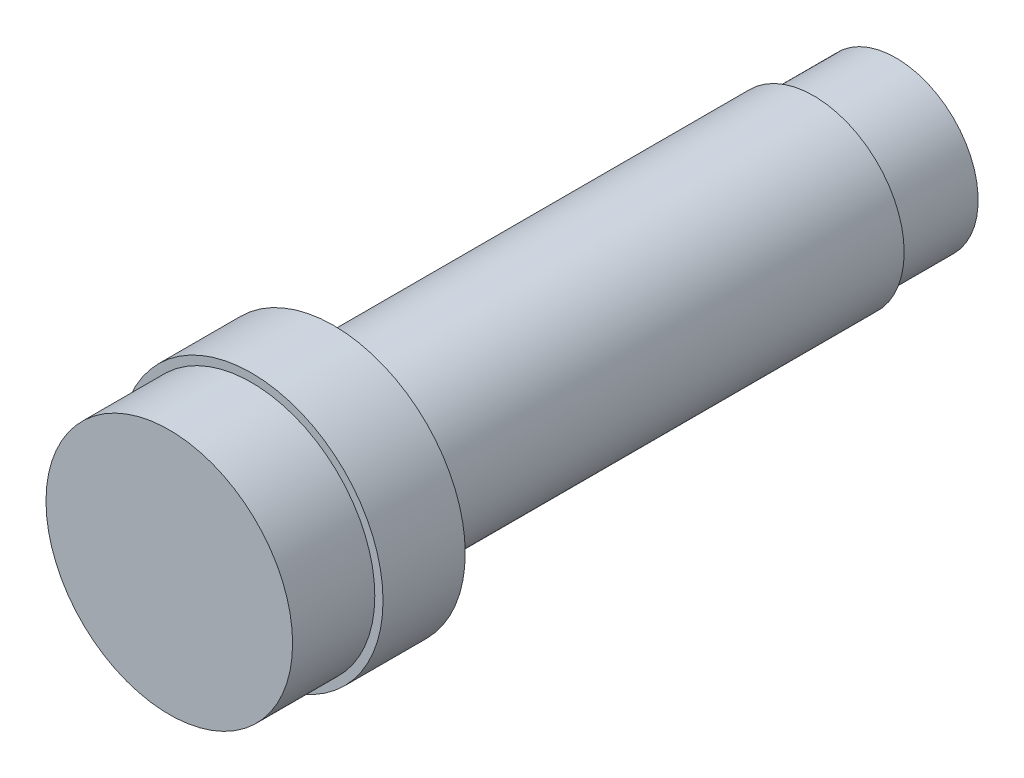
ISO-10303-21;
HEADER;
FILE_DESCRIPTION(('STEP AP214'),'2;1');
FILE_NAME('part.step','',(''),(''),'','','');
FILE_SCHEMA(('AUTOMOTIVE_DESIGN { 1 0 10303 214 1 1 1 1 }'));
ENDSEC;
DATA;
#1=APPLICATION_CONTEXT('core data for automotive mechanical design processes');
#2=APPLICATION_PROTOCOL_DEFINITION('international standard','automotive_design',2000,#1);
#3=PRODUCT_CONTEXT('',#1,'mechanical');
#4=PRODUCT('Part','Part','',(#3));
#5=PRODUCT_RELATED_PRODUCT_CATEGORY('part','',(#4));
#6=PRODUCT_DEFINITION_FORMATION('','',#4);
#7=PRODUCT_DEFINITION_CONTEXT('part definition',#1,'design');
#8=PRODUCT_DEFINITION('design','',#6,#7);
#9=PRODUCT_DEFINITION_SHAPE('','',#8);
#10=(LENGTH_UNIT() NAMED_UNIT(*) SI_UNIT(.MILLI.,.METRE.));
#11=(NAMED_UNIT(*) PLANE_ANGLE_UNIT() SI_UNIT($,.RADIAN.));
#12=(NAMED_UNIT(*) SI_UNIT($,.STERADIAN.) SOLID_ANGLE_UNIT());
#13=UNCERTAINTY_MEASURE_WITH_UNIT(LENGTH_MEASURE(1.E-05),#10,'distance_accuracy_value','');
#14=(GEOMETRIC_REPRESENTATION_CONTEXT(3) GLOBAL_UNCERTAINTY_ASSIGNED_CONTEXT((#13)) GLOBAL_UNIT_ASSIGNED_CONTEXT((#10,
#11,#12)) REPRESENTATION_CONTEXT('',''));
#15=CARTESIAN_POINT('',(0.,0.,0.));
#16=DIRECTION('',(0.,0.,1.));
#17=DIRECTION('',(1.,0.,0.));
#18=AXIS2_PLACEMENT_3D('',#15,#16,#17);
#19=CARTESIAN_POINT('',(0.,0.,34.2));
#20=DIRECTION('',(0.,0.,-1.));
#21=DIRECTION('',(-1.,0.,0.));
#22=AXIS2_PLACEMENT_3D('',#19,#20,#21);
#23=CYLINDRICAL_SURFACE('',#22,5.5);
#24=CARTESIAN_POINT('',(0.,0.,0.));
#25=DIRECTION('',(0.,0.,1.));
#26=DIRECTION('',(1.,0.,0.));
#27=AXIS2_PLACEMENT_3D('',#24,#25,#26);
#28=CIRCLE('',#27,5.5);
#29=CARTESIAN_POINT('',(5.5,0.,0.));
#30=VERTEX_POINT('',#29);
#31=EDGE_CURVE('E64',#30,#30,#28,.T.);
#32=ORIENTED_EDGE('',*,*,#31,.T.);
#33=EDGE_LOOP('',(#32));
#34=FACE_BOUND('',#33,.T.);
#35=CARTESIAN_POINT('',(0.,0.,29.2));
#36=DIRECTION('',(0.,0.,1.));
#37=DIRECTION('',(1.,0.,0.));
#38=AXIS2_PLACEMENT_3D('',#35,#36,#37);
#39=CIRCLE('',#38,5.5);
#40=CARTESIAN_POINT('',(5.5,0.,29.2));
#41=VERTEX_POINT('',#40);
#42=EDGE_CURVE('E40',#41,#41,#39,.T.);
#43=ORIENTED_EDGE('',*,*,#42,.F.);
#44=EDGE_LOOP('',(#43));
#45=FACE_BOUND('',#44,.T.);
#46=ADVANCED_FACE('F37',(#34,#45),#23,.T.);
#47=CARTESIAN_POINT('',(0.,0.,0.));
#48=DIRECTION('',(0.,0.,1.));
#49=DIRECTION('',(1.,0.,0.));
#50=AXIS2_PLACEMENT_3D('',#47,#48,#49);
#51=PLANE('',#50);
#52=CARTESIAN_POINT('',(0.,0.,0.));
#53=DIRECTION('',(0.,0.,-1.));
#54=DIRECTION('',(-1.,0.,0.));
#55=AXIS2_PLACEMENT_3D('',#52,#53,#54);
#56=CIRCLE('',#55,5.);
#57=CARTESIAN_POINT('',(-5.,0.,0.));
#58=VERTEX_POINT('',#57);
#59=EDGE_CURVE('E10',#58,#58,#56,.T.);
#60=ORIENTED_EDGE('',*,*,#59,.F.);
#61=EDGE_LOOP('',(#60));
#62=FACE_BOUND('',#61,.T.);
#63=ORIENTED_EDGE('',*,*,#31,.F.);
#64=EDGE_LOOP('',(#63));
#65=FACE_BOUND('',#64,.T.);
#66=ADVANCED_FACE('F79',(#62,#65),#51,.F.);
#67=CARTESIAN_POINT('',(0.,0.,29.2));
#68=DIRECTION('',(0.,0.,1.));
#69=DIRECTION('',(1.,0.,0.));
#70=AXIS2_PLACEMENT_3D('',#67,#68,#69);
#71=CYLINDRICAL_SURFACE('',#70,8.);
#72=CARTESIAN_POINT('',(0.,0.,29.2));
#73=DIRECTION('',(0.,0.,1.));
#74=DIRECTION('',(1.,0.,0.));
#75=AXIS2_PLACEMENT_3D('',#72,#73,#74);
#76=CIRCLE('',#75,8.);
#77=CARTESIAN_POINT('',(8.,0.,29.2));
#78=VERTEX_POINT('',#77);
#79=EDGE_CURVE('E60',#78,#78,#76,.T.);
#80=ORIENTED_EDGE('',*,*,#79,.T.);
#81=EDGE_LOOP('',(#80));
#82=FACE_BOUND('',#81,.T.);
#83=CARTESIAN_POINT('',(0.,0.,34.2));
#84=DIRECTION('',(0.,0.,1.));
#85=DIRECTION('',(1.,0.,0.));
#86=AXIS2_PLACEMENT_3D('',#83,#84,#85);
#87=CIRCLE('',#86,8.);
#88=CARTESIAN_POINT('',(8.,0.,34.2));
#89=VERTEX_POINT('',#88);
#90=EDGE_CURVE('E58',#89,#89,#87,.T.);
#91=ORIENTED_EDGE('',*,*,#90,.F.);
#92=EDGE_LOOP('',(#91));
#93=FACE_BOUND('',#92,.T.);
#94=ADVANCED_FACE('F83',(#82,#93),#71,.T.);
#95=CARTESIAN_POINT('',(0.,0.,29.2));
#96=DIRECTION('',(0.,0.,1.));
#97=DIRECTION('',(1.,0.,0.));
#98=AXIS2_PLACEMENT_3D('',#95,#96,#97);
#99=PLANE('',#98);
#100=ORIENTED_EDGE('',*,*,#42,.T.);
#101=EDGE_LOOP('',(#100));
#102=FACE_BOUND('',#101,.T.);
#103=ORIENTED_EDGE('',*,*,#79,.F.);
#104=EDGE_LOOP('',(#103));
#105=FACE_BOUND('',#104,.T.);
#106=ADVANCED_FACE('F75',(#102,#105),#99,.F.);
#107=CARTESIAN_POINT('',(0.,0.,34.2));
#108=DIRECTION('',(0.,0.,1.));
#109=DIRECTION('',(1.,0.,0.));
#110=AXIS2_PLACEMENT_3D('',#107,#108,#109);
#111=PLANE('',#110);
#112=CARTESIAN_POINT('',(0.,0.,34.2));
#113=DIRECTION('',(0.,0.,1.));
#114=DIRECTION('',(1.,0.,0.));
#115=AXIS2_PLACEMENT_3D('',#112,#113,#114);
#116=CIRCLE('',#115,7.5);
#117=CARTESIAN_POINT('',(7.5,0.,34.2));
#118=VERTEX_POINT('',#117);
#119=EDGE_CURVE('E45',#118,#118,#116,.T.);
#120=ORIENTED_EDGE('',*,*,#119,.F.);
#121=EDGE_LOOP('',(#120));
#122=FACE_BOUND('',#121,.T.);
#123=ORIENTED_EDGE('',*,*,#90,.T.);
#124=EDGE_LOOP('',(#123));
#125=FACE_BOUND('',#124,.T.);
#126=ADVANCED_FACE('F92',(#122,#125),#111,.T.);
#127=CARTESIAN_POINT('',(0.,0.,39.2));
#128=DIRECTION('',(0.,0.,-1.));
#129=DIRECTION('',(-1.,0.,0.));
#130=AXIS2_PLACEMENT_3D('',#127,#128,#129);
#131=CYLINDRICAL_SURFACE('',#130,7.5);
#132=CARTESIAN_POINT('',(0.,0.,39.2));
#133=DIRECTION('',(0.,0.,1.));
#134=DIRECTION('',(1.,0.,0.));
#135=AXIS2_PLACEMENT_3D('',#132,#133,#134);
#136=CIRCLE('',#135,7.5);
#137=CARTESIAN_POINT('',(7.5,0.,39.2));
#138=VERTEX_POINT('',#137);
#139=EDGE_CURVE('E55',#138,#138,#136,.T.);
#140=ORIENTED_EDGE('',*,*,#139,.F.);
#141=EDGE_LOOP('',(#140));
#142=FACE_BOUND('',#141,.T.);
#143=ORIENTED_EDGE('',*,*,#119,.T.);
#144=EDGE_LOOP('',(#143));
#145=FACE_BOUND('',#144,.T.);
#146=ADVANCED_FACE('F94',(#142,#145),#131,.T.);
#147=CARTESIAN_POINT('',(0.,0.,39.2));
#148=DIRECTION('',(0.,0.,1.));
#149=DIRECTION('',(1.,0.,0.));
#150=AXIS2_PLACEMENT_3D('',#147,#148,#149);
#151=PLANE('',#150);
#152=ORIENTED_EDGE('',*,*,#139,.T.);
#153=EDGE_LOOP('',(#152));
#154=FACE_BOUND('',#153,.T.);
#155=ADVANCED_FACE('F101',(#154),#151,.T.);
#156=CARTESIAN_POINT('',(0.,0.,-5.));
#157=DIRECTION('',(0.,0.,1.));
#158=DIRECTION('',(1.,0.,0.));
#159=AXIS2_PLACEMENT_3D('',#156,#157,#158);
#160=CYLINDRICAL_SURFACE('',#159,5.);
#161=CARTESIAN_POINT('',(0.,0.,-5.));
#162=DIRECTION('',(0.,0.,-1.));
#163=DIRECTION('',(-1.,0.,0.));
#164=AXIS2_PLACEMENT_3D('',#161,#162,#163);
#165=CIRCLE('',#164,5.);
#166=CARTESIAN_POINT('',(-5.,0.,-5.));
#167=VERTEX_POINT('',#166);
#168=EDGE_CURVE('E54',#167,#167,#165,.T.);
#169=ORIENTED_EDGE('',*,*,#168,.F.);
#170=EDGE_LOOP('',(#169));
#171=FACE_BOUND('',#170,.T.);
#172=ORIENTED_EDGE('',*,*,#59,.T.);
#173=EDGE_LOOP('',(#172));
#174=FACE_BOUND('',#173,.T.);
#175=ADVANCED_FACE('F105',(#171,#174),#160,.T.);
#176=CARTESIAN_POINT('',(0.,0.,-5.));
#177=DIRECTION('',(0.,0.,-1.));
#178=DIRECTION('',(-1.,0.,0.));
#179=AXIS2_PLACEMENT_3D('',#176,#177,#178);
#180=PLANE('',#179);
#181=ORIENTED_EDGE('',*,*,#168,.T.);
#182=EDGE_LOOP('',(#181));
#183=FACE_BOUND('',#182,.T.);
#184=ADVANCED_FACE('F109',(#183),#180,.T.);
#185=CLOSED_SHELL('',(#46,#66,#94,#106,#126,#146,#155,#175,#184));
#186=MANIFOLD_SOLID_BREP('B2',#185);
#187=ADVANCED_BREP_SHAPE_REPRESENTATION('',(#18,#186),#14);
#188=SHAPE_DEFINITION_REPRESENTATION(#9,#187);
ENDSEC;
END-ISO-10303-21;
